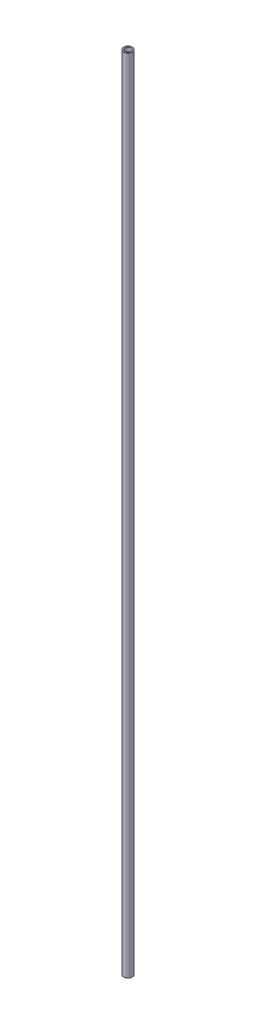
ISO-10303-21;
HEADER;
FILE_DESCRIPTION(('STEP AP214'),'2;1');
FILE_NAME('part.step','',(''),(''),'','','');
FILE_SCHEMA(('AUTOMOTIVE_DESIGN { 1 0 10303 214 1 1 1 1 }'));
ENDSEC;
DATA;
#1=APPLICATION_CONTEXT('core data for automotive mechanical design processes');
#2=APPLICATION_PROTOCOL_DEFINITION('international standard','automotive_design',2000,#1);
#3=PRODUCT_CONTEXT('',#1,'mechanical');
#4=PRODUCT('Part','Part','',(#3));
#5=PRODUCT_RELATED_PRODUCT_CATEGORY('part','',(#4));
#6=PRODUCT_DEFINITION_FORMATION('','',#4);
#7=PRODUCT_DEFINITION_CONTEXT('part definition',#1,'design');
#8=PRODUCT_DEFINITION('design','',#6,#7);
#9=PRODUCT_DEFINITION_SHAPE('','',#8);
#10=(LENGTH_UNIT() NAMED_UNIT(*) SI_UNIT(.MILLI.,.METRE.));
#11=(NAMED_UNIT(*) PLANE_ANGLE_UNIT() SI_UNIT($,.RADIAN.));
#12=(NAMED_UNIT(*) SI_UNIT($,.STERADIAN.) SOLID_ANGLE_UNIT());
#13=UNCERTAINTY_MEASURE_WITH_UNIT(LENGTH_MEASURE(1.E-05),#10,'distance_accuracy_value','');
#14=(GEOMETRIC_REPRESENTATION_CONTEXT(3) GLOBAL_UNCERTAINTY_ASSIGNED_CONTEXT((#13)) GLOBAL_UNIT_ASSIGNED_CONTEXT((#10,
#11,#12)) REPRESENTATION_CONTEXT('',''));
#15=CARTESIAN_POINT('',(0.,0.,0.));
#16=DIRECTION('',(0.,0.,1.));
#17=DIRECTION('',(1.,0.,0.));
#18=AXIS2_PLACEMENT_3D('',#15,#16,#17);
#19=CARTESIAN_POINT('',(0.,266.7,0.));
#20=DIRECTION('',(0.,-1.,0.));
#21=DIRECTION('',(0.,0.,-1.));
#22=AXIS2_PLACEMENT_3D('',#19,#20,#21);
#23=CYLINDRICAL_SURFACE('',#22,1.016);
#24=CARTESIAN_POINT('',(0.,0.,0.));
#25=DIRECTION('',(0.,-1.,0.));
#26=DIRECTION('',(0.,0.,-1.));
#27=AXIS2_PLACEMENT_3D('',#24,#25,#26);
#28=CIRCLE('',#27,1.016);
#29=CARTESIAN_POINT('',(0.,0.,-1.016));
#30=VERTEX_POINT('',#29);
#31=EDGE_CURVE('E28',#30,#30,#28,.T.);
#32=ORIENTED_EDGE('',*,*,#31,.T.);
#33=EDGE_LOOP('',(#32));
#34=FACE_BOUND('',#33,.T.);
#35=CARTESIAN_POINT('',(0.,266.7,0.));
#36=DIRECTION('',(0.,-1.,0.));
#37=DIRECTION('',(0.,0.,-1.));
#38=AXIS2_PLACEMENT_3D('',#35,#36,#37);
#39=CIRCLE('',#38,1.016);
#40=CARTESIAN_POINT('',(0.,266.7,-1.016));
#41=VERTEX_POINT('',#40);
#42=EDGE_CURVE('E19',#41,#41,#39,.T.);
#43=ORIENTED_EDGE('',*,*,#42,.F.);
#44=EDGE_LOOP('',(#43));
#45=FACE_BOUND('',#44,.T.);
#46=ADVANCED_FACE('F16',(#34,#45),#23,.F.);
#47=CARTESIAN_POINT('',(0.,266.7,0.));
#48=DIRECTION('',(0.,1.,0.));
#49=DIRECTION('',(0.,0.,1.));
#50=AXIS2_PLACEMENT_3D('',#47,#48,#49);
#51=PLANE('',#50);
#52=ORIENTED_EDGE('',*,*,#42,.T.);
#53=EDGE_LOOP('',(#52));
#54=FACE_BOUND('',#53,.T.);
#55=CARTESIAN_POINT('',(0.,266.7,0.));
#56=DIRECTION('',(0.,-1.,0.));
#57=DIRECTION('',(0.,0.,-1.));
#58=AXIS2_PLACEMENT_3D('',#55,#56,#57);
#59=CIRCLE('',#58,1.46685);
#60=CARTESIAN_POINT('',(0.,266.7,-1.46685));
#61=VERTEX_POINT('',#60);
#62=EDGE_CURVE('E23',#61,#61,#59,.T.);
#63=ORIENTED_EDGE('',*,*,#62,.F.);
#64=EDGE_LOOP('',(#63));
#65=FACE_BOUND('',#64,.T.);
#66=ADVANCED_FACE('F36',(#54,#65),#51,.T.);
#67=CARTESIAN_POINT('',(0.,0.,0.));
#68=DIRECTION('',(0.,1.,0.));
#69=DIRECTION('',(0.,0.,1.));
#70=AXIS2_PLACEMENT_3D('',#67,#68,#69);
#71=PLANE('',#70);
#72=ORIENTED_EDGE('',*,*,#31,.F.);
#73=EDGE_LOOP('',(#72));
#74=FACE_BOUND('',#73,.T.);
#75=CARTESIAN_POINT('',(0.,0.,0.));
#76=DIRECTION('',(0.,-1.,0.));
#77=DIRECTION('',(0.,0.,-1.));
#78=AXIS2_PLACEMENT_3D('',#75,#76,#77);
#79=CIRCLE('',#78,1.46685);
#80=CARTESIAN_POINT('',(0.,0.,-1.46685));
#81=VERTEX_POINT('',#80);
#82=EDGE_CURVE('E10',#81,#81,#79,.F.);
#83=ORIENTED_EDGE('',*,*,#82,.F.);
#84=EDGE_LOOP('',(#83));
#85=FACE_BOUND('',#84,.T.);
#86=ADVANCED_FACE('F43',(#74,#85),#71,.F.);
#87=CARTESIAN_POINT('',(0.,266.7,0.));
#88=DIRECTION('',(0.,-1.,0.));
#89=DIRECTION('',(0.,0.,-1.));
#90=AXIS2_PLACEMENT_3D('',#87,#88,#89);
#91=CYLINDRICAL_SURFACE('',#90,1.46685);
#92=ORIENTED_EDGE('',*,*,#82,.T.);
#93=EDGE_LOOP('',(#92));
#94=FACE_BOUND('',#93,.T.);
#95=ORIENTED_EDGE('',*,*,#62,.T.);
#96=EDGE_LOOP('',(#95));
#97=FACE_BOUND('',#96,.T.);
#98=ADVANCED_FACE('F44',(#94,#97),#91,.T.);
#99=CLOSED_SHELL('',(#46,#66,#86,#98));
#100=MANIFOLD_SOLID_BREP('B1',#99);
#101=ADVANCED_BREP_SHAPE_REPRESENTATION('',(#18,#100),#14);
#102=SHAPE_DEFINITION_REPRESENTATION(#9,#101);
ENDSEC;
END-ISO-10303-21;
